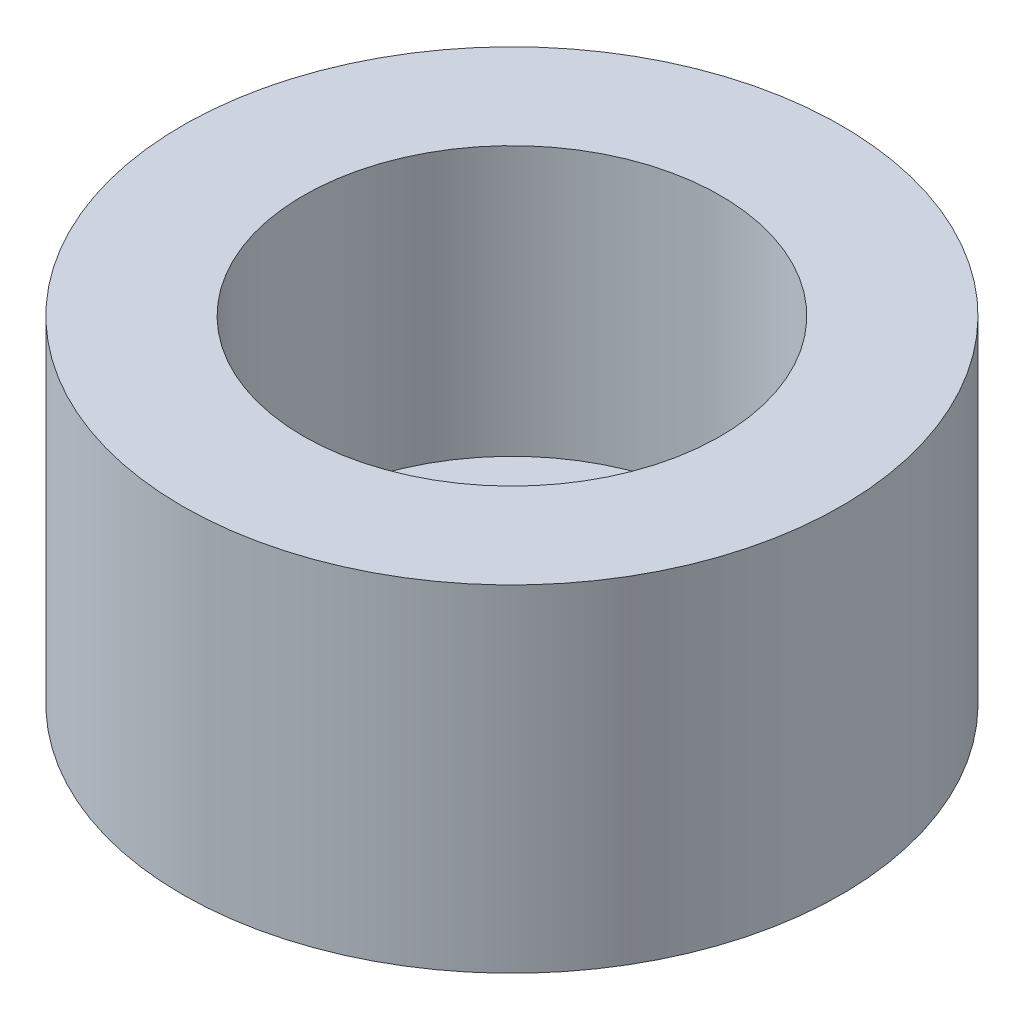
ISO-10303-21;
HEADER;
FILE_DESCRIPTION(('STEP AP214'),'2;1');
FILE_NAME('part.step','',(''),(''),'','','');
FILE_SCHEMA(('AUTOMOTIVE_DESIGN { 1 0 10303 214 1 1 1 1 }'));
ENDSEC;
DATA;
#1=APPLICATION_CONTEXT('core data for automotive mechanical design processes');
#2=APPLICATION_PROTOCOL_DEFINITION('international standard','automotive_design',2000,#1);
#3=PRODUCT_CONTEXT('',#1,'mechanical');
#4=PRODUCT('Part','Part','',(#3));
#5=PRODUCT_RELATED_PRODUCT_CATEGORY('part','',(#4));
#6=PRODUCT_DEFINITION_FORMATION('','',#4);
#7=PRODUCT_DEFINITION_CONTEXT('part definition',#1,'design');
#8=PRODUCT_DEFINITION('design','',#6,#7);
#9=PRODUCT_DEFINITION_SHAPE('','',#8);
#10=(LENGTH_UNIT() NAMED_UNIT(*) SI_UNIT(.MILLI.,.METRE.));
#11=(NAMED_UNIT(*) PLANE_ANGLE_UNIT() SI_UNIT($,.RADIAN.));
#12=(NAMED_UNIT(*) SI_UNIT($,.STERADIAN.) SOLID_ANGLE_UNIT());
#13=UNCERTAINTY_MEASURE_WITH_UNIT(LENGTH_MEASURE(1.E-05),#10,'distance_accuracy_value','');
#14=(GEOMETRIC_REPRESENTATION_CONTEXT(3) GLOBAL_UNCERTAINTY_ASSIGNED_CONTEXT((#13)) GLOBAL_UNIT_ASSIGNED_CONTEXT((#10,
#11,#12)) REPRESENTATION_CONTEXT('',''));
#15=CARTESIAN_POINT('',(0.,0.,0.));
#16=DIRECTION('',(0.,0.,1.));
#17=DIRECTION('',(1.,0.,0.));
#18=AXIS2_PLACEMENT_3D('',#15,#16,#17);
#19=CARTESIAN_POINT('',(0.,2.5,0.));
#20=DIRECTION('',(0.,-1.,0.));
#21=DIRECTION('',(0.,0.,-1.));
#22=AXIS2_PLACEMENT_3D('',#19,#20,#21);
#23=CYLINDRICAL_SURFACE('',#22,2.45);
#24=CARTESIAN_POINT('',(0.,2.5,0.));
#25=DIRECTION('',(0.,1.,0.));
#26=DIRECTION('',(0.,0.,1.));
#27=AXIS2_PLACEMENT_3D('',#24,#25,#26);
#28=CIRCLE('',#27,2.45);
#29=CARTESIAN_POINT('',(0.,2.5,2.45));
#30=VERTEX_POINT('',#29);
#31=EDGE_CURVE('E10',#30,#30,#28,.T.);
#32=ORIENTED_EDGE('',*,*,#31,.F.);
#33=EDGE_LOOP('',(#32));
#34=FACE_BOUND('',#33,.T.);
#35=CARTESIAN_POINT('',(0.,0.,0.));
#36=DIRECTION('',(0.,1.,0.));
#37=DIRECTION('',(0.,0.,1.));
#38=AXIS2_PLACEMENT_3D('',#35,#36,#37);
#39=CIRCLE('',#38,2.45);
#40=CARTESIAN_POINT('',(0.,0.,2.45));
#41=VERTEX_POINT('',#40);
#42=EDGE_CURVE('E34',#41,#41,#39,.T.);
#43=ORIENTED_EDGE('',*,*,#42,.T.);
#44=EDGE_LOOP('',(#43));
#45=FACE_BOUND('',#44,.T.);
#46=ADVANCED_FACE('F31',(#34,#45),#23,.T.);
#47=CARTESIAN_POINT('',(0.,2.5,0.));
#48=DIRECTION('',(0.,1.,0.));
#49=DIRECTION('',(0.,0.,1.));
#50=AXIS2_PLACEMENT_3D('',#47,#48,#49);
#51=PLANE('',#50);
#52=CARTESIAN_POINT('',(0.,2.5,0.));
#53=DIRECTION('',(0.,1.,0.));
#54=DIRECTION('',(0.,0.,1.));
#55=AXIS2_PLACEMENT_3D('',#52,#53,#54);
#56=CIRCLE('',#55,1.55);
#57=CARTESIAN_POINT('',(0.,2.5,1.55));
#58=VERTEX_POINT('',#57);
#59=EDGE_CURVE('E43',#58,#58,#56,.T.);
#60=ORIENTED_EDGE('',*,*,#59,.F.);
#61=EDGE_LOOP('',(#60));
#62=FACE_BOUND('',#61,.T.);
#63=ORIENTED_EDGE('',*,*,#31,.T.);
#64=EDGE_LOOP('',(#63));
#65=FACE_BOUND('',#64,.T.);
#66=ADVANCED_FACE('F58',(#62,#65),#51,.T.);
#67=CARTESIAN_POINT('',(0.,0.,0.));
#68=DIRECTION('',(0.,1.,0.));
#69=DIRECTION('',(0.,0.,1.));
#70=AXIS2_PLACEMENT_3D('',#67,#68,#69);
#71=PLANE('',#70);
#72=ORIENTED_EDGE('',*,*,#42,.F.);
#73=EDGE_LOOP('',(#72));
#74=FACE_BOUND('',#73,.T.);
#75=ADVANCED_FACE('F54',(#74),#71,.F.);
#76=CARTESIAN_POINT('',(0.,0.5,0.));
#77=DIRECTION('',(0.,1.,0.));
#78=DIRECTION('',(0.,0.,1.));
#79=AXIS2_PLACEMENT_3D('',#76,#77,#78);
#80=CYLINDRICAL_SURFACE('',#79,1.55);
#81=CARTESIAN_POINT('',(0.,0.5,0.));
#82=DIRECTION('',(0.,1.,0.));
#83=DIRECTION('',(0.,0.,1.));
#84=AXIS2_PLACEMENT_3D('',#81,#82,#83);
#85=CIRCLE('',#84,1.55);
#86=CARTESIAN_POINT('',(0.,0.5,1.55));
#87=VERTEX_POINT('',#86);
#88=EDGE_CURVE('E41',#87,#87,#85,.T.);
#89=ORIENTED_EDGE('',*,*,#88,.F.);
#90=EDGE_LOOP('',(#89));
#91=FACE_BOUND('',#90,.T.);
#92=ORIENTED_EDGE('',*,*,#59,.T.);
#93=EDGE_LOOP('',(#92));
#94=FACE_BOUND('',#93,.T.);
#95=ADVANCED_FACE('F51',(#91,#94),#80,.F.);
#96=CARTESIAN_POINT('',(0.,0.5,0.));
#97=DIRECTION('',(0.,1.,0.));
#98=DIRECTION('',(0.,0.,1.));
#99=AXIS2_PLACEMENT_3D('',#96,#97,#98);
#100=PLANE('',#99);
#101=ORIENTED_EDGE('',*,*,#88,.T.);
#102=EDGE_LOOP('',(#101));
#103=FACE_BOUND('',#102,.T.);
#104=ADVANCED_FACE('F49',(#103),#100,.T.);
#105=CLOSED_SHELL('',(#46,#66,#75,#95,#104));
#106=MANIFOLD_SOLID_BREP('B2',#105);
#107=ADVANCED_BREP_SHAPE_REPRESENTATION('',(#18,#106),#14);
#108=SHAPE_DEFINITION_REPRESENTATION(#9,#107);
ENDSEC;
END-ISO-10303-21;
